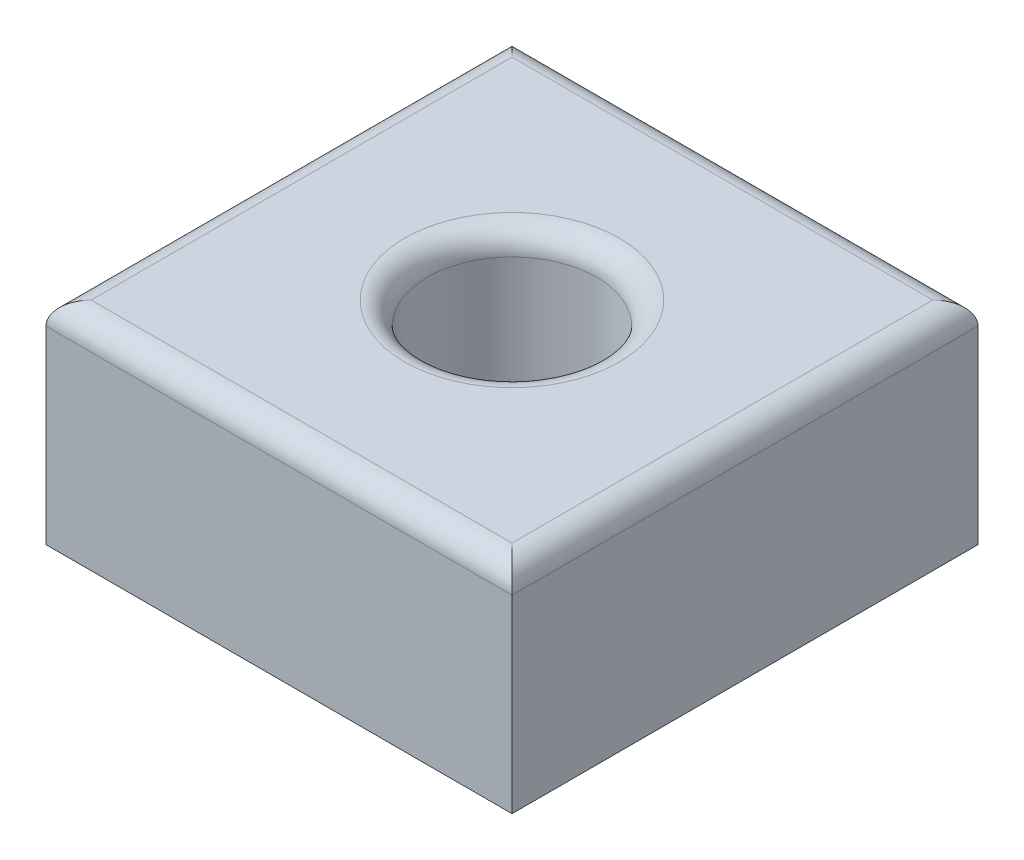
ISO-10303-21;
HEADER;
FILE_DESCRIPTION(('STEP AP214'),'2;1');
FILE_NAME('part.step','',(''),(''),'','','');
FILE_SCHEMA(('AUTOMOTIVE_DESIGN { 1 0 10303 214 1 1 1 1 }'));
ENDSEC;
DATA;
#1=APPLICATION_CONTEXT('core data for automotive mechanical design processes');
#2=APPLICATION_PROTOCOL_DEFINITION('international standard','automotive_design',2000,#1);
#3=PRODUCT_CONTEXT('',#1,'mechanical');
#4=PRODUCT('Part','Part','',(#3));
#5=PRODUCT_RELATED_PRODUCT_CATEGORY('part','',(#4));
#6=PRODUCT_DEFINITION_FORMATION('','',#4);
#7=PRODUCT_DEFINITION_CONTEXT('part definition',#1,'design');
#8=PRODUCT_DEFINITION('design','',#6,#7);
#9=PRODUCT_DEFINITION_SHAPE('','',#8);
#10=(LENGTH_UNIT() NAMED_UNIT(*) SI_UNIT(.MILLI.,.METRE.));
#11=(NAMED_UNIT(*) PLANE_ANGLE_UNIT() SI_UNIT($,.RADIAN.));
#12=(NAMED_UNIT(*) SI_UNIT($,.STERADIAN.) SOLID_ANGLE_UNIT());
#13=UNCERTAINTY_MEASURE_WITH_UNIT(LENGTH_MEASURE(1.E-05),#10,'distance_accuracy_value','');
#14=(GEOMETRIC_REPRESENTATION_CONTEXT(3) GLOBAL_UNCERTAINTY_ASSIGNED_CONTEXT((#13)) GLOBAL_UNIT_ASSIGNED_CONTEXT((#10,
#11,#12)) REPRESENTATION_CONTEXT('',''));
#15=CARTESIAN_POINT('',(0.,0.,0.));
#16=DIRECTION('',(0.,0.,1.));
#17=DIRECTION('',(1.,0.,0.));
#18=AXIS2_PLACEMENT_3D('',#15,#16,#17);
#19=CARTESIAN_POINT('',(0.,23.8125,0.));
#20=DIRECTION('',(0.,1.,0.));
#21=DIRECTION('',(0.,0.,1.));
#22=AXIS2_PLACEMENT_3D('',#19,#20,#21);
#23=PLANE('',#22);
#24=CARTESIAN_POINT('',(0.,23.8125,0.));
#25=DIRECTION('',(0.,1.,0.));
#26=DIRECTION('',(0.,0.,1.));
#27=AXIS2_PLACEMENT_3D('',#24,#25,#26);
#28=CIRCLE('',#27,12.065);
#29=CARTESIAN_POINT('',(0.,23.8125,12.065));
#30=VERTEX_POINT('',#29);
#31=EDGE_CURVE('E144',#30,#30,#28,.F.);
#32=ORIENTED_EDGE('',*,*,#31,.T.);
#33=EDGE_LOOP('',(#32));
#34=FACE_BOUND('',#33,.T.);
#35=DIRECTION('',(0.,0.,-1.));
#36=VECTOR('',#35,1.);
#37=CARTESIAN_POINT('',(23.65375,23.8125,-26.19375));
#38=LINE('',#37,#36);
#39=CARTESIAN_POINT('',(23.65375,23.8125,23.65375));
#40=VERTEX_POINT('',#39);
#41=CARTESIAN_POINT('',(23.65375,23.8125,-23.65375));
#42=VERTEX_POINT('',#41);
#43=EDGE_CURVE('E137',#40,#42,#38,.T.);
#44=ORIENTED_EDGE('',*,*,#43,.T.);
#45=DIRECTION('',(-1.,0.,0.));
#46=VECTOR('',#45,1.);
#47=CARTESIAN_POINT('',(-26.19375,23.8125,-23.65375));
#48=LINE('',#47,#46);
#49=CARTESIAN_POINT('',(-23.65375,23.8125,-23.65375));
#50=VERTEX_POINT('',#49);
#51=EDGE_CURVE('E140',#42,#50,#48,.T.);
#52=ORIENTED_EDGE('',*,*,#51,.T.);
#53=DIRECTION('',(0.,0.,1.));
#54=VECTOR('',#53,1.);
#55=CARTESIAN_POINT('',(-23.65375,23.8125,26.19375));
#56=LINE('',#55,#54);
#57=CARTESIAN_POINT('',(-23.65375,23.8125,23.65375));
#58=VERTEX_POINT('',#57);
#59=EDGE_CURVE('E132',#50,#58,#56,.T.);
#60=ORIENTED_EDGE('',*,*,#59,.T.);
#61=DIRECTION('',(1.,0.,0.));
#62=VECTOR('',#61,1.);
#63=CARTESIAN_POINT('',(26.19375,23.8125,23.65375));
#64=LINE('',#63,#62);
#65=EDGE_CURVE('E134',#58,#40,#64,.T.);
#66=ORIENTED_EDGE('',*,*,#65,.T.);
#67=EDGE_LOOP('',(#44,#52,#60,#66));
#68=FACE_BOUND('',#67,.T.);
#69=ADVANCED_FACE('F37',(#34,#68),#23,.T.);
#70=CARTESIAN_POINT('',(0.,0.,0.));
#71=DIRECTION('',(0.,1.,0.));
#72=DIRECTION('',(0.,0.,1.));
#73=AXIS2_PLACEMENT_3D('',#70,#71,#72);
#74=PLANE('',#73);
#75=DIRECTION('',(0.,0.,1.));
#76=VECTOR('',#75,1.);
#77=CARTESIAN_POINT('',(-26.19375,0.,-26.19375));
#78=LINE('',#77,#76);
#79=CARTESIAN_POINT('',(-26.19375,0.,-26.19375));
#80=VERTEX_POINT('',#79);
#81=CARTESIAN_POINT('',(-26.19375,0.,26.19375));
#82=VERTEX_POINT('',#81);
#83=EDGE_CURVE('E105',#80,#82,#78,.T.);
#84=ORIENTED_EDGE('',*,*,#83,.F.);
#85=DIRECTION('',(-1.,0.,0.));
#86=VECTOR('',#85,1.);
#87=CARTESIAN_POINT('',(-26.19375,0.,-26.19375));
#88=LINE('',#87,#86);
#89=CARTESIAN_POINT('',(26.19375,0.,-26.19375));
#90=VERTEX_POINT('',#89);
#91=EDGE_CURVE('E122',#90,#80,#88,.T.);
#92=ORIENTED_EDGE('',*,*,#91,.F.);
#93=DIRECTION('',(0.,0.,-1.));
#94=VECTOR('',#93,1.);
#95=CARTESIAN_POINT('',(26.19375,0.,-26.19375));
#96=LINE('',#95,#94);
#97=CARTESIAN_POINT('',(26.19375,0.,26.19375));
#98=VERTEX_POINT('',#97);
#99=EDGE_CURVE('E107',#98,#90,#96,.T.);
#100=ORIENTED_EDGE('',*,*,#99,.F.);
#101=DIRECTION('',(1.,0.,0.));
#102=VECTOR('',#101,1.);
#103=CARTESIAN_POINT('',(-26.19375,0.,26.19375));
#104=LINE('',#103,#102);
#105=EDGE_CURVE('E92',#82,#98,#104,.T.);
#106=ORIENTED_EDGE('',*,*,#105,.F.);
#107=EDGE_LOOP('',(#84,#92,#100,#106));
#108=FACE_BOUND('',#107,.T.);
#109=CARTESIAN_POINT('',(0.,0.,0.));
#110=DIRECTION('',(0.,1.,0.));
#111=DIRECTION('',(0.,0.,1.));
#112=AXIS2_PLACEMENT_3D('',#109,#110,#111);
#113=CIRCLE('',#112,9.525);
#114=CARTESIAN_POINT('',(0.,0.,9.525));
#115=VERTEX_POINT('',#114);
#116=EDGE_CURVE('E114',#115,#115,#113,.T.);
#117=ORIENTED_EDGE('',*,*,#116,.T.);
#118=EDGE_LOOP('',(#117));
#119=FACE_BOUND('',#118,.T.);
#120=ADVANCED_FACE('F102',(#108,#119),#74,.F.);
#121=CARTESIAN_POINT('',(-26.19375,23.8125,-26.19375));
#122=DIRECTION('',(1.,0.,0.));
#123=DIRECTION('',(0.,0.,-1.));
#124=AXIS2_PLACEMENT_3D('',#121,#122,#123);
#125=PLANE('',#124);
#126=DIRECTION('',(0.,-1.,0.));
#127=VECTOR('',#126,1.);
#128=CARTESIAN_POINT('',(-26.19375,23.8125,26.19375));
#129=LINE('',#128,#127);
#130=CARTESIAN_POINT('',(-26.19375,21.2725,26.19375));
#131=VERTEX_POINT('',#130);
#132=EDGE_CURVE('E89',#131,#82,#129,.T.);
#133=ORIENTED_EDGE('',*,*,#132,.F.);
#134=DIRECTION('',(0.,0.,1.));
#135=VECTOR('',#134,1.);
#136=CARTESIAN_POINT('',(-26.19375,21.2725,-26.19375));
#137=LINE('',#136,#135);
#138=CARTESIAN_POINT('',(-26.19375,21.2725,-26.19375));
#139=VERTEX_POINT('',#138);
#140=EDGE_CURVE('E11',#131,#139,#137,.F.);
#141=ORIENTED_EDGE('',*,*,#140,.T.);
#142=DIRECTION('',(0.,-1.,0.));
#143=VECTOR('',#142,1.);
#144=CARTESIAN_POINT('',(-26.19375,23.8125,-26.19375));
#145=LINE('',#144,#143);
#146=EDGE_CURVE('E112',#139,#80,#145,.T.);
#147=ORIENTED_EDGE('',*,*,#146,.T.);
#148=ORIENTED_EDGE('',*,*,#83,.T.);
#149=EDGE_LOOP('',(#133,#141,#147,#148));
#150=FACE_BOUND('',#149,.T.);
#151=ADVANCED_FACE('F110',(#150),#125,.F.);
#152=CARTESIAN_POINT('',(-26.19375,23.8125,26.19375));
#153=DIRECTION('',(0.,0.,-1.));
#154=DIRECTION('',(-1.,0.,0.));
#155=AXIS2_PLACEMENT_3D('',#152,#153,#154);
#156=PLANE('',#155);
#157=DIRECTION('',(0.,-1.,0.));
#158=VECTOR('',#157,1.);
#159=CARTESIAN_POINT('',(26.19375,23.8125,26.19375));
#160=LINE('',#159,#158);
#161=CARTESIAN_POINT('',(26.19375,21.2725,26.19375));
#162=VERTEX_POINT('',#161);
#163=EDGE_CURVE('E98',#162,#98,#160,.T.);
#164=ORIENTED_EDGE('',*,*,#163,.F.);
#165=DIRECTION('',(1.,0.,0.));
#166=VECTOR('',#165,1.);
#167=CARTESIAN_POINT('',(-26.19375,21.2725,26.19375));
#168=LINE('',#167,#166);
#169=EDGE_CURVE('E46',#162,#131,#168,.F.);
#170=ORIENTED_EDGE('',*,*,#169,.T.);
#171=ORIENTED_EDGE('',*,*,#132,.T.);
#172=ORIENTED_EDGE('',*,*,#105,.T.);
#173=EDGE_LOOP('',(#164,#170,#171,#172));
#174=FACE_BOUND('',#173,.T.);
#175=ADVANCED_FACE('F91',(#174),#156,.F.);
#176=CARTESIAN_POINT('',(26.19375,23.8125,-26.19375));
#177=DIRECTION('',(-1.,0.,0.));
#178=DIRECTION('',(0.,0.,1.));
#179=AXIS2_PLACEMENT_3D('',#176,#177,#178);
#180=PLANE('',#179);
#181=DIRECTION('',(0.,-1.,0.));
#182=VECTOR('',#181,1.);
#183=CARTESIAN_POINT('',(26.19375,23.8125,-26.19375));
#184=LINE('',#183,#182);
#185=CARTESIAN_POINT('',(26.19375,21.2725,-26.19375));
#186=VERTEX_POINT('',#185);
#187=EDGE_CURVE('E126',#186,#90,#184,.T.);
#188=ORIENTED_EDGE('',*,*,#187,.F.);
#189=DIRECTION('',(0.,0.,-1.));
#190=VECTOR('',#189,1.);
#191=CARTESIAN_POINT('',(26.19375,21.2725,26.19375));
#192=LINE('',#191,#190);
#193=EDGE_CURVE('E61',#186,#162,#192,.F.);
#194=ORIENTED_EDGE('',*,*,#193,.T.);
#195=ORIENTED_EDGE('',*,*,#163,.T.);
#196=ORIENTED_EDGE('',*,*,#99,.T.);
#197=EDGE_LOOP('',(#188,#194,#195,#196));
#198=FACE_BOUND('',#197,.T.);
#199=ADVANCED_FACE('F192',(#198),#180,.F.);
#200=CARTESIAN_POINT('',(-26.19375,23.8125,-26.19375));
#201=DIRECTION('',(0.,0.,1.));
#202=DIRECTION('',(1.,0.,0.));
#203=AXIS2_PLACEMENT_3D('',#200,#201,#202);
#204=PLANE('',#203);
#205=ORIENTED_EDGE('',*,*,#146,.F.);
#206=DIRECTION('',(-1.,0.,0.));
#207=VECTOR('',#206,1.);
#208=CARTESIAN_POINT('',(26.19375,21.2725,-26.19375));
#209=LINE('',#208,#207);
#210=EDGE_CURVE('E148',#139,#186,#209,.F.);
#211=ORIENTED_EDGE('',*,*,#210,.T.);
#212=ORIENTED_EDGE('',*,*,#187,.T.);
#213=ORIENTED_EDGE('',*,*,#91,.T.);
#214=EDGE_LOOP('',(#205,#211,#212,#213));
#215=FACE_BOUND('',#214,.T.);
#216=ADVANCED_FACE('F175',(#215),#204,.F.);
#217=CARTESIAN_POINT('',(0.,23.8125,0.));
#218=DIRECTION('',(0.,-1.,0.));
#219=DIRECTION('',(0.,0.,-1.));
#220=AXIS2_PLACEMENT_3D('',#217,#218,#219);
#221=CYLINDRICAL_SURFACE('',#220,9.525);
#222=CARTESIAN_POINT('',(0.,21.2725,0.));
#223=DIRECTION('',(0.,1.,0.));
#224=DIRECTION('',(0.,0.,1.));
#225=AXIS2_PLACEMENT_3D('',#222,#223,#224);
#226=CIRCLE('',#225,9.525);
#227=CARTESIAN_POINT('',(0.,21.2725,9.525));
#228=VERTEX_POINT('',#227);
#229=EDGE_CURVE('E97',#228,#228,#226,.T.);
#230=ORIENTED_EDGE('',*,*,#229,.T.);
#231=EDGE_LOOP('',(#230));
#232=FACE_BOUND('',#231,.T.);
#233=ORIENTED_EDGE('',*,*,#116,.F.);
#234=EDGE_LOOP('',(#233));
#235=FACE_BOUND('',#234,.T.);
#236=ADVANCED_FACE('F188',(#232,#235),#221,.F.);
#237=CARTESIAN_POINT('',(0.,21.2725,0.));
#238=DIRECTION('',(0.,1.,0.));
#239=DIRECTION('',(0.,0.,1.));
#240=AXIS2_PLACEMENT_3D('',#237,#238,#239);
#241=TOROIDAL_SURFACE('',#240,12.065,2.54);
#242=ORIENTED_EDGE('',*,*,#31,.F.);
#243=EDGE_LOOP('',(#242));
#244=FACE_BOUND('',#243,.T.);
#245=ORIENTED_EDGE('',*,*,#229,.F.);
#246=EDGE_LOOP('',(#245));
#247=FACE_BOUND('',#246,.T.);
#248=ADVANCED_FACE('F199',(#244,#247),#241,.T.);
#249=CARTESIAN_POINT('',(0.,21.2725,23.65375));
#250=DIRECTION('',(-1.,0.,0.));
#251=DIRECTION('',(0.,0.,1.));
#252=AXIS2_PLACEMENT_3D('',#249,#250,#251);
#253=CYLINDRICAL_SURFACE('',#252,2.54);
#254=CARTESIAN_POINT('',(-23.65375,21.2725,23.65375));
#255=DIRECTION('',(-0.707106781186547,0.,-0.707106781186547));
#256=DIRECTION('',(0.707106781186547,0.,-0.707106781186548));
#257=AXIS2_PLACEMENT_3D('',#254,#255,#256);
#258=ELLIPSE('',#257,3.59210244842766,2.54);
#259=EDGE_CURVE('E158',#131,#58,#258,.T.);
#260=ORIENTED_EDGE('',*,*,#259,.F.);
#261=ORIENTED_EDGE('',*,*,#169,.F.);
#262=CARTESIAN_POINT('',(23.65375,21.2725,23.65375));
#263=DIRECTION('',(-0.707106781186547,0.,0.707106781186547));
#264=DIRECTION('',(-0.707106781186547,0.,-0.707106781186547));
#265=AXIS2_PLACEMENT_3D('',#262,#263,#264);
#266=ELLIPSE('',#265,3.59210244842766,2.54);
#267=EDGE_CURVE('E41',#40,#162,#266,.F.);
#268=ORIENTED_EDGE('',*,*,#267,.F.);
#269=ORIENTED_EDGE('',*,*,#65,.F.);
#270=EDGE_LOOP('',(#260,#261,#268,#269));
#271=FACE_BOUND('',#270,.T.);
#272=ADVANCED_FACE('F39',(#271),#253,.T.);
#273=CARTESIAN_POINT('',(23.65375,21.2725,0.));
#274=DIRECTION('',(0.,0.,1.));
#275=DIRECTION('',(1.,0.,0.));
#276=AXIS2_PLACEMENT_3D('',#273,#274,#275);
#277=CYLINDRICAL_SURFACE('',#276,2.54);
#278=ORIENTED_EDGE('',*,*,#267,.T.);
#279=ORIENTED_EDGE('',*,*,#193,.F.);
#280=CARTESIAN_POINT('',(23.65375,21.2725,-23.65375));
#281=DIRECTION('',(0.707106781186547,0.,0.707106781186547));
#282=DIRECTION('',(-0.707106781186547,0.,0.707106781186547));
#283=AXIS2_PLACEMENT_3D('',#280,#281,#282);
#284=ELLIPSE('',#283,3.59210244842766,2.54);
#285=EDGE_CURVE('E157',#42,#186,#284,.F.);
#286=ORIENTED_EDGE('',*,*,#285,.F.);
#287=ORIENTED_EDGE('',*,*,#43,.F.);
#288=EDGE_LOOP('',(#278,#279,#286,#287));
#289=FACE_BOUND('',#288,.T.);
#290=ADVANCED_FACE('F167',(#289),#277,.T.);
#291=CARTESIAN_POINT('',(-23.65375,21.2725,0.));
#292=DIRECTION('',(0.,0.,-1.));
#293=DIRECTION('',(-1.,0.,0.));
#294=AXIS2_PLACEMENT_3D('',#291,#292,#293);
#295=CYLINDRICAL_SURFACE('',#294,2.54);
#296=ORIENTED_EDGE('',*,*,#259,.T.);
#297=ORIENTED_EDGE('',*,*,#59,.F.);
#298=CARTESIAN_POINT('',(-23.65375,21.2725,-23.65375));
#299=DIRECTION('',(0.707106781186547,0.,-0.707106781186548));
#300=DIRECTION('',(-0.707106781186547,0.,-0.707106781186547));
#301=AXIS2_PLACEMENT_3D('',#298,#299,#300);
#302=ELLIPSE('',#301,3.59210244842766,2.54);
#303=EDGE_CURVE('E155',#139,#50,#302,.T.);
#304=ORIENTED_EDGE('',*,*,#303,.F.);
#305=ORIENTED_EDGE('',*,*,#140,.F.);
#306=EDGE_LOOP('',(#296,#297,#304,#305));
#307=FACE_BOUND('',#306,.T.);
#308=ADVANCED_FACE('F172',(#307),#295,.T.);
#309=CARTESIAN_POINT('',(0.,21.2725,-23.65375));
#310=DIRECTION('',(1.,0.,0.));
#311=DIRECTION('',(0.,0.,-1.));
#312=AXIS2_PLACEMENT_3D('',#309,#310,#311);
#313=CYLINDRICAL_SURFACE('',#312,2.54);
#314=ORIENTED_EDGE('',*,*,#285,.T.);
#315=ORIENTED_EDGE('',*,*,#210,.F.);
#316=ORIENTED_EDGE('',*,*,#303,.T.);
#317=ORIENTED_EDGE('',*,*,#51,.F.);
#318=EDGE_LOOP('',(#314,#315,#316,#317));
#319=FACE_BOUND('',#318,.T.);
#320=ADVANCED_FACE('F177',(#319),#313,.T.);
#321=CLOSED_SHELL('',(#69,#120,#151,#175,#199,#216,#236,#248,#272,#290,#308,#320));
#322=MANIFOLD_SOLID_BREP('B2',#321);
#323=ADVANCED_BREP_SHAPE_REPRESENTATION('',(#18,#322),#14);
#324=SHAPE_DEFINITION_REPRESENTATION(#9,#323);
ENDSEC;
END-ISO-10303-21;
